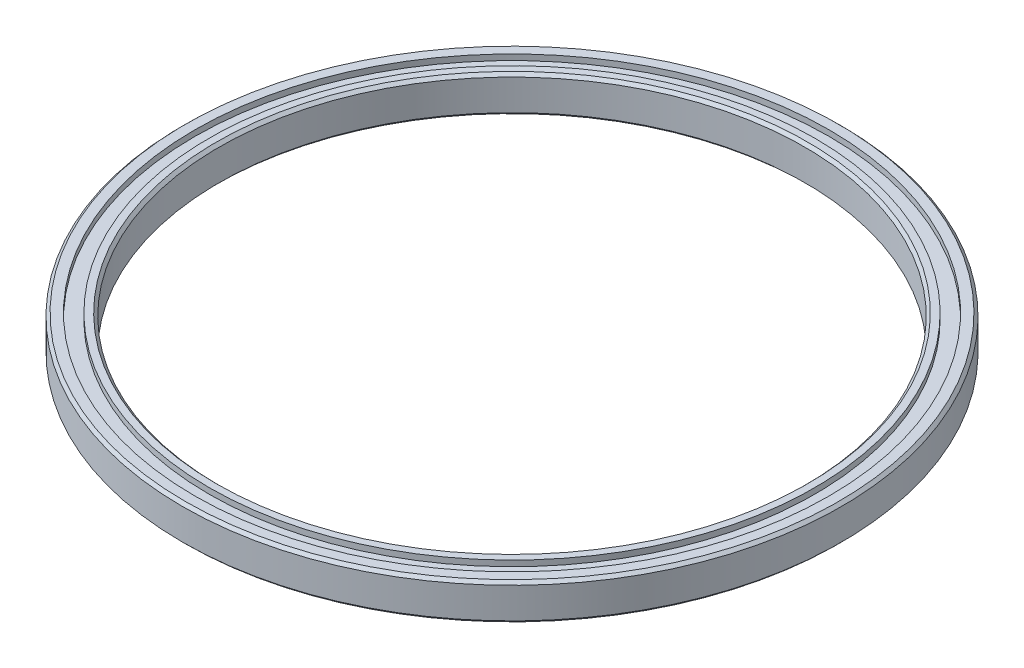
ISO-10303-21;
HEADER;
FILE_DESCRIPTION(('STEP AP214'),'2;1');
FILE_NAME('part.step','',(''),(''),'','','');
FILE_SCHEMA(('AUTOMOTIVE_DESIGN { 1 0 10303 214 1 1 1 1 }'));
ENDSEC;
DATA;
#1=APPLICATION_CONTEXT('core data for automotive mechanical design processes');
#2=APPLICATION_PROTOCOL_DEFINITION('international standard','automotive_design',2000,#1);
#3=PRODUCT_CONTEXT('',#1,'mechanical');
#4=PRODUCT('Part','Part','',(#3));
#5=PRODUCT_RELATED_PRODUCT_CATEGORY('part','',(#4));
#6=PRODUCT_DEFINITION_FORMATION('','',#4);
#7=PRODUCT_DEFINITION_CONTEXT('part definition',#1,'design');
#8=PRODUCT_DEFINITION('design','',#6,#7);
#9=PRODUCT_DEFINITION_SHAPE('','',#8);
#10=(LENGTH_UNIT() NAMED_UNIT(*) SI_UNIT(.MILLI.,.METRE.));
#11=(NAMED_UNIT(*) PLANE_ANGLE_UNIT() SI_UNIT($,.RADIAN.));
#12=(NAMED_UNIT(*) SI_UNIT($,.STERADIAN.) SOLID_ANGLE_UNIT());
#13=UNCERTAINTY_MEASURE_WITH_UNIT(LENGTH_MEASURE(1.E-05),#10,'distance_accuracy_value','');
#14=(GEOMETRIC_REPRESENTATION_CONTEXT(3) GLOBAL_UNCERTAINTY_ASSIGNED_CONTEXT((#13)) GLOBAL_UNIT_ASSIGNED_CONTEXT((#10,
#11,#12)) REPRESENTATION_CONTEXT('',''));
#15=CARTESIAN_POINT('',(0.,0.,0.));
#16=DIRECTION('',(0.,0.,1.));
#17=DIRECTION('',(1.,0.,0.));
#18=AXIS2_PLACEMENT_3D('',#15,#16,#17);
#19=CARTESIAN_POINT('',(0.,0.,0.));
#20=DIRECTION('',(0.,1.,0.));
#21=DIRECTION('',(0.,0.,1.));
#22=AXIS2_PLACEMENT_3D('',#19,#20,#21);
#23=PLANE('',#22);
#24=CARTESIAN_POINT('',(0.,0.,0.));
#25=DIRECTION('',(0.,1.,0.));
#26=DIRECTION('',(0.,0.,1.));
#27=AXIS2_PLACEMENT_3D('',#24,#25,#26);
#28=CIRCLE('',#27,51.3);
#29=CARTESIAN_POINT('',(0.,0.,51.3));
#30=VERTEX_POINT('',#29);
#31=EDGE_CURVE('E48',#30,#30,#28,.T.);
#32=ORIENTED_EDGE('',*,*,#31,.T.);
#33=EDGE_LOOP('',(#32));
#34=FACE_BOUND('',#33,.T.);
#35=CARTESIAN_POINT('',(0.,0.,0.));
#36=DIRECTION('',(0.,-1.,0.));
#37=DIRECTION('',(0.,0.,-1.));
#38=AXIS2_PLACEMENT_3D('',#35,#36,#37);
#39=CIRCLE('',#38,52.5);
#40=CARTESIAN_POINT('',(0.,0.,-52.5));
#41=VERTEX_POINT('',#40);
#42=EDGE_CURVE('E105',#41,#41,#39,.T.);
#43=ORIENTED_EDGE('',*,*,#42,.T.);
#44=EDGE_LOOP('',(#43));
#45=FACE_BOUND('',#44,.T.);
#46=ADVANCED_FACE('F39',(#34,#45),#23,.F.);
#47=CARTESIAN_POINT('',(0.,6.35,0.));
#48=DIRECTION('',(0.,1.,0.));
#49=DIRECTION('',(0.,0.,1.));
#50=AXIS2_PLACEMENT_3D('',#47,#48,#49);
#51=PLANE('',#50);
#52=CARTESIAN_POINT('',(0.,6.35,0.));
#53=DIRECTION('',(0.,1.,0.));
#54=DIRECTION('',(0.,0.,1.));
#55=AXIS2_PLACEMENT_3D('',#52,#53,#54);
#56=CIRCLE('',#55,51.3);
#57=CARTESIAN_POINT('',(0.,6.35,51.3));
#58=VERTEX_POINT('',#57);
#59=EDGE_CURVE('E68',#58,#58,#56,.F.);
#60=ORIENTED_EDGE('',*,*,#59,.T.);
#61=EDGE_LOOP('',(#60));
#62=FACE_BOUND('',#61,.T.);
#63=CARTESIAN_POINT('',(0.,6.35,0.));
#64=DIRECTION('',(0.,1.,0.));
#65=DIRECTION('',(0.,0.,1.));
#66=AXIS2_PLACEMENT_3D('',#63,#64,#65);
#67=CIRCLE('',#66,52.5);
#68=CARTESIAN_POINT('',(0.,6.35,52.5));
#69=VERTEX_POINT('',#68);
#70=EDGE_CURVE('E89',#69,#69,#67,.T.);
#71=ORIENTED_EDGE('',*,*,#70,.T.);
#72=EDGE_LOOP('',(#71));
#73=FACE_BOUND('',#72,.T.);
#74=ADVANCED_FACE('F141',(#62,#73),#51,.T.);
#75=CARTESIAN_POINT('',(0.,6.35,0.));
#76=DIRECTION('',(0.,1.,0.));
#77=DIRECTION('',(0.,0.,1.));
#78=AXIS2_PLACEMENT_3D('',#75,#76,#77);
#79=CIRCLE('',#78,56.65);
#80=CARTESIAN_POINT('',(0.,6.35,56.65));
#81=VERTEX_POINT('',#80);
#82=EDGE_CURVE('E64',#81,#81,#79,.T.);
#83=ORIENTED_EDGE('',*,*,#82,.T.);
#84=EDGE_LOOP('',(#83));
#85=FACE_BOUND('',#84,.T.);
#86=CARTESIAN_POINT('',(0.,6.35,0.));
#87=DIRECTION('',(0.,1.,0.));
#88=DIRECTION('',(0.,0.,1.));
#89=AXIS2_PLACEMENT_3D('',#86,#87,#88);
#90=CIRCLE('',#89,55.);
#91=CARTESIAN_POINT('',(0.,6.35,55.));
#92=VERTEX_POINT('',#91);
#93=EDGE_CURVE('E81',#92,#92,#90,.T.);
#94=ORIENTED_EDGE('',*,*,#93,.F.);
#95=EDGE_LOOP('',(#94));
#96=FACE_BOUND('',#95,.T.);
#97=ADVANCED_FACE('F132',(#85,#96),#51,.T.);
#98=CARTESIAN_POINT('',(0.,0.,0.));
#99=DIRECTION('',(0.,1.,0.));
#100=DIRECTION('',(0.,0.,1.));
#101=AXIS2_PLACEMENT_3D('',#98,#99,#100);
#102=CIRCLE('',#101,56.65);
#103=CARTESIAN_POINT('',(0.,0.,56.65));
#104=VERTEX_POINT('',#103);
#105=EDGE_CURVE('E10',#104,#104,#102,.F.);
#106=ORIENTED_EDGE('',*,*,#105,.T.);
#107=EDGE_LOOP('',(#106));
#108=FACE_BOUND('',#107,.T.);
#109=CARTESIAN_POINT('',(0.,0.,0.));
#110=DIRECTION('',(0.,-1.,0.));
#111=DIRECTION('',(0.,0.,-1.));
#112=AXIS2_PLACEMENT_3D('',#109,#110,#111);
#113=CIRCLE('',#112,55.);
#114=CARTESIAN_POINT('',(0.,0.,-55.));
#115=VERTEX_POINT('',#114);
#116=EDGE_CURVE('E97',#115,#115,#113,.T.);
#117=ORIENTED_EDGE('',*,*,#116,.F.);
#118=EDGE_LOOP('',(#117));
#119=FACE_BOUND('',#118,.T.);
#120=ADVANCED_FACE('F129',(#108,#119),#23,.F.);
#121=CARTESIAN_POINT('',(0.,6.35,0.));
#122=DIRECTION('',(0.,-1.,0.));
#123=DIRECTION('',(0.,0.,-1.));
#124=AXIS2_PLACEMENT_3D('',#121,#122,#123);
#125=CYLINDRICAL_SURFACE('',#124,57.15);
#126=CARTESIAN_POINT('',(0.,5.85000000000005,0.));
#127=DIRECTION('',(0.,1.,0.));
#128=DIRECTION('',(0.,0.,1.));
#129=AXIS2_PLACEMENT_3D('',#126,#127,#128);
#130=CIRCLE('',#129,57.15);
#131=CARTESIAN_POINT('',(0.,5.85000000000005,57.15));
#132=VERTEX_POINT('',#131);
#133=EDGE_CURVE('E53',#132,#132,#130,.F.);
#134=ORIENTED_EDGE('',*,*,#133,.T.);
#135=EDGE_LOOP('',(#134));
#136=FACE_BOUND('',#135,.T.);
#137=CARTESIAN_POINT('',(0.,0.500000000000021,0.));
#138=DIRECTION('',(0.,1.,0.));
#139=DIRECTION('',(0.,0.,1.));
#140=AXIS2_PLACEMENT_3D('',#137,#138,#139);
#141=CIRCLE('',#140,57.15);
#142=CARTESIAN_POINT('',(0.,0.500000000000021,57.15));
#143=VERTEX_POINT('',#142);
#144=EDGE_CURVE('E58',#143,#143,#141,.T.);
#145=ORIENTED_EDGE('',*,*,#144,.T.);
#146=EDGE_LOOP('',(#145));
#147=FACE_BOUND('',#146,.T.);
#148=ADVANCED_FACE('F131',(#136,#147),#125,.T.);
#149=CARTESIAN_POINT('',(0.,6.35,0.));
#150=DIRECTION('',(0.,-1.,0.));
#151=DIRECTION('',(0.,0.,-1.));
#152=AXIS2_PLACEMENT_3D('',#149,#150,#151);
#153=CYLINDRICAL_SURFACE('',#152,50.8);
#154=CARTESIAN_POINT('',(0.,5.85,0.));
#155=DIRECTION('',(0.,1.,0.));
#156=DIRECTION('',(0.,0.,1.));
#157=AXIS2_PLACEMENT_3D('',#154,#155,#156);
#158=CIRCLE('',#157,50.8);
#159=CARTESIAN_POINT('',(0.,5.85,50.8));
#160=VERTEX_POINT('',#159);
#161=EDGE_CURVE('E72',#160,#160,#158,.T.);
#162=ORIENTED_EDGE('',*,*,#161,.T.);
#163=EDGE_LOOP('',(#162));
#164=FACE_BOUND('',#163,.T.);
#165=CARTESIAN_POINT('',(0.,0.499999999999987,0.));
#166=DIRECTION('',(0.,1.,0.));
#167=DIRECTION('',(0.,0.,1.));
#168=AXIS2_PLACEMENT_3D('',#165,#166,#167);
#169=CIRCLE('',#168,50.8);
#170=CARTESIAN_POINT('',(0.,0.499999999999987,50.8));
#171=VERTEX_POINT('',#170);
#172=EDGE_CURVE('E76',#171,#171,#169,.F.);
#173=ORIENTED_EDGE('',*,*,#172,.T.);
#174=EDGE_LOOP('',(#173));
#175=FACE_BOUND('',#174,.T.);
#176=ADVANCED_FACE('F138',(#164,#175),#153,.F.);
#177=CARTESIAN_POINT('',(0.,5.35,0.));
#178=DIRECTION('',(0.,1.,0.));
#179=DIRECTION('',(0.,0.,1.));
#180=AXIS2_PLACEMENT_3D('',#177,#178,#179);
#181=CYLINDRICAL_SURFACE('',#180,55.);
#182=CARTESIAN_POINT('',(0.,5.35,0.));
#183=DIRECTION('',(0.,1.,0.));
#184=DIRECTION('',(0.,0.,1.));
#185=AXIS2_PLACEMENT_3D('',#182,#183,#184);
#186=CIRCLE('',#185,55.);
#187=CARTESIAN_POINT('',(0.,5.35,55.));
#188=VERTEX_POINT('',#187);
#189=EDGE_CURVE('E80',#188,#188,#186,.T.);
#190=ORIENTED_EDGE('',*,*,#189,.F.);
#191=EDGE_LOOP('',(#190));
#192=FACE_BOUND('',#191,.T.);
#193=ORIENTED_EDGE('',*,*,#93,.T.);
#194=EDGE_LOOP('',(#193));
#195=FACE_BOUND('',#194,.T.);
#196=ADVANCED_FACE('F167',(#192,#195),#181,.F.);
#197=CARTESIAN_POINT('',(0.,5.35,0.));
#198=DIRECTION('',(0.,1.,0.));
#199=DIRECTION('',(0.,0.,1.));
#200=AXIS2_PLACEMENT_3D('',#197,#198,#199);
#201=PLANE('',#200);
#202=CARTESIAN_POINT('',(0.,5.35,0.));
#203=DIRECTION('',(0.,1.,0.));
#204=DIRECTION('',(0.,0.,1.));
#205=AXIS2_PLACEMENT_3D('',#202,#203,#204);
#206=CIRCLE('',#205,52.5);
#207=CARTESIAN_POINT('',(0.,5.35,52.5));
#208=VERTEX_POINT('',#207);
#209=EDGE_CURVE('E85',#208,#208,#206,.T.);
#210=ORIENTED_EDGE('',*,*,#209,.F.);
#211=EDGE_LOOP('',(#210));
#212=FACE_BOUND('',#211,.T.);
#213=ORIENTED_EDGE('',*,*,#189,.T.);
#214=EDGE_LOOP('',(#213));
#215=FACE_BOUND('',#214,.T.);
#216=ADVANCED_FACE('F163',(#212,#215),#201,.T.);
#217=CARTESIAN_POINT('',(0.,5.35,0.));
#218=DIRECTION('',(0.,1.,0.));
#219=DIRECTION('',(0.,0.,1.));
#220=AXIS2_PLACEMENT_3D('',#217,#218,#219);
#221=CYLINDRICAL_SURFACE('',#220,52.5);
#222=ORIENTED_EDGE('',*,*,#209,.T.);
#223=EDGE_LOOP('',(#222));
#224=FACE_BOUND('',#223,.T.);
#225=ORIENTED_EDGE('',*,*,#70,.F.);
#226=EDGE_LOOP('',(#225));
#227=FACE_BOUND('',#226,.T.);
#228=ADVANCED_FACE('F125',(#224,#227),#221,.T.);
#229=CARTESIAN_POINT('',(0.,1.,0.));
#230=DIRECTION('',(0.,-1.,0.));
#231=DIRECTION('',(0.,0.,-1.));
#232=AXIS2_PLACEMENT_3D('',#229,#230,#231);
#233=CYLINDRICAL_SURFACE('',#232,55.);
#234=CARTESIAN_POINT('',(0.,1.,0.));
#235=DIRECTION('',(0.,-1.,0.));
#236=DIRECTION('',(0.,0.,-1.));
#237=AXIS2_PLACEMENT_3D('',#234,#235,#236);
#238=CIRCLE('',#237,55.);
#239=CARTESIAN_POINT('',(0.,1.,-55.));
#240=VERTEX_POINT('',#239);
#241=EDGE_CURVE('E93',#240,#240,#238,.T.);
#242=ORIENTED_EDGE('',*,*,#241,.F.);
#243=EDGE_LOOP('',(#242));
#244=FACE_BOUND('',#243,.T.);
#245=ORIENTED_EDGE('',*,*,#116,.T.);
#246=EDGE_LOOP('',(#245));
#247=FACE_BOUND('',#246,.T.);
#248=ADVANCED_FACE('F119',(#244,#247),#233,.F.);
#249=CARTESIAN_POINT('',(0.,1.,0.));
#250=DIRECTION('',(0.,-1.,0.));
#251=DIRECTION('',(0.,0.,-1.));
#252=AXIS2_PLACEMENT_3D('',#249,#250,#251);
#253=PLANE('',#252);
#254=CARTESIAN_POINT('',(0.,1.,0.));
#255=DIRECTION('',(0.,-1.,0.));
#256=DIRECTION('',(0.,0.,-1.));
#257=AXIS2_PLACEMENT_3D('',#254,#255,#256);
#258=CIRCLE('',#257,52.5);
#259=CARTESIAN_POINT('',(0.,1.,-52.5));
#260=VERTEX_POINT('',#259);
#261=EDGE_CURVE('E101',#260,#260,#258,.T.);
#262=ORIENTED_EDGE('',*,*,#261,.F.);
#263=EDGE_LOOP('',(#262));
#264=FACE_BOUND('',#263,.T.);
#265=ORIENTED_EDGE('',*,*,#241,.T.);
#266=EDGE_LOOP('',(#265));
#267=FACE_BOUND('',#266,.T.);
#268=ADVANCED_FACE('F116',(#264,#267),#253,.T.);
#269=CARTESIAN_POINT('',(0.,1.,0.));
#270=DIRECTION('',(0.,-1.,0.));
#271=DIRECTION('',(0.,0.,-1.));
#272=AXIS2_PLACEMENT_3D('',#269,#270,#271);
#273=CYLINDRICAL_SURFACE('',#272,52.5);
#274=ORIENTED_EDGE('',*,*,#261,.T.);
#275=EDGE_LOOP('',(#274));
#276=FACE_BOUND('',#275,.T.);
#277=ORIENTED_EDGE('',*,*,#42,.F.);
#278=EDGE_LOOP('',(#277));
#279=FACE_BOUND('',#278,.T.);
#280=ADVANCED_FACE('F113',(#276,#279),#273,.T.);
#281=CARTESIAN_POINT('',(0.,5.85,0.));
#282=DIRECTION('',(0.,1.,0.));
#283=DIRECTION('',(0.,0.,1.));
#284=AXIS2_PLACEMENT_3D('',#281,#282,#283);
#285=CONICAL_SURFACE('',#284,50.8,0.785398163397455);
#286=ORIENTED_EDGE('',*,*,#59,.F.);
#287=EDGE_LOOP('',(#286));
#288=FACE_BOUND('',#287,.T.);
#289=ORIENTED_EDGE('',*,*,#161,.F.);
#290=EDGE_LOOP('',(#289));
#291=FACE_BOUND('',#290,.T.);
#292=ADVANCED_FACE('F152',(#288,#291),#285,.F.);
#293=CARTESIAN_POINT('',(0.,6.35,0.));
#294=DIRECTION('',(0.,-1.,0.));
#295=DIRECTION('',(0.,0.,-1.));
#296=AXIS2_PLACEMENT_3D('',#293,#294,#295);
#297=CONICAL_SURFACE('',#296,56.65,0.785398163397469);
#298=ORIENTED_EDGE('',*,*,#133,.F.);
#299=EDGE_LOOP('',(#298));
#300=FACE_BOUND('',#299,.T.);
#301=ORIENTED_EDGE('',*,*,#82,.F.);
#302=EDGE_LOOP('',(#301));
#303=FACE_BOUND('',#302,.T.);
#304=ADVANCED_FACE('F157',(#300,#303),#297,.T.);
#305=CARTESIAN_POINT('',(0.,0.,0.));
#306=DIRECTION('',(0.,-1.,0.));
#307=DIRECTION('',(0.,0.,-1.));
#308=AXIS2_PLACEMENT_3D('',#305,#306,#307);
#309=CONICAL_SURFACE('',#308,51.3,0.785398163397455);
#310=ORIENTED_EDGE('',*,*,#172,.F.);
#311=EDGE_LOOP('',(#310));
#312=FACE_BOUND('',#311,.T.);
#313=ORIENTED_EDGE('',*,*,#31,.F.);
#314=EDGE_LOOP('',(#313));
#315=FACE_BOUND('',#314,.T.);
#316=ADVANCED_FACE('F180',(#312,#315),#309,.F.);
#317=CARTESIAN_POINT('',(0.,0.500000000000021,0.));
#318=DIRECTION('',(0.,1.,0.));
#319=DIRECTION('',(0.,0.,1.));
#320=AXIS2_PLACEMENT_3D('',#317,#318,#319);
#321=CONICAL_SURFACE('',#320,57.15,0.785398163397441);
#322=ORIENTED_EDGE('',*,*,#105,.F.);
#323=EDGE_LOOP('',(#322));
#324=FACE_BOUND('',#323,.T.);
#325=ORIENTED_EDGE('',*,*,#144,.F.);
#326=EDGE_LOOP('',(#325));
#327=FACE_BOUND('',#326,.T.);
#328=ADVANCED_FACE('F42',(#324,#327),#321,.T.);
#329=CLOSED_SHELL('',(#46,#74,#97,#120,#148,#176,#196,#216,#228,#248,#268,#280,#292,#304,#316,#328));
#330=MANIFOLD_SOLID_BREP('B2',#329);
#331=ADVANCED_BREP_SHAPE_REPRESENTATION('',(#18,#330),#14);
#332=SHAPE_DEFINITION_REPRESENTATION(#9,#331);
ENDSEC;
END-ISO-10303-21;
